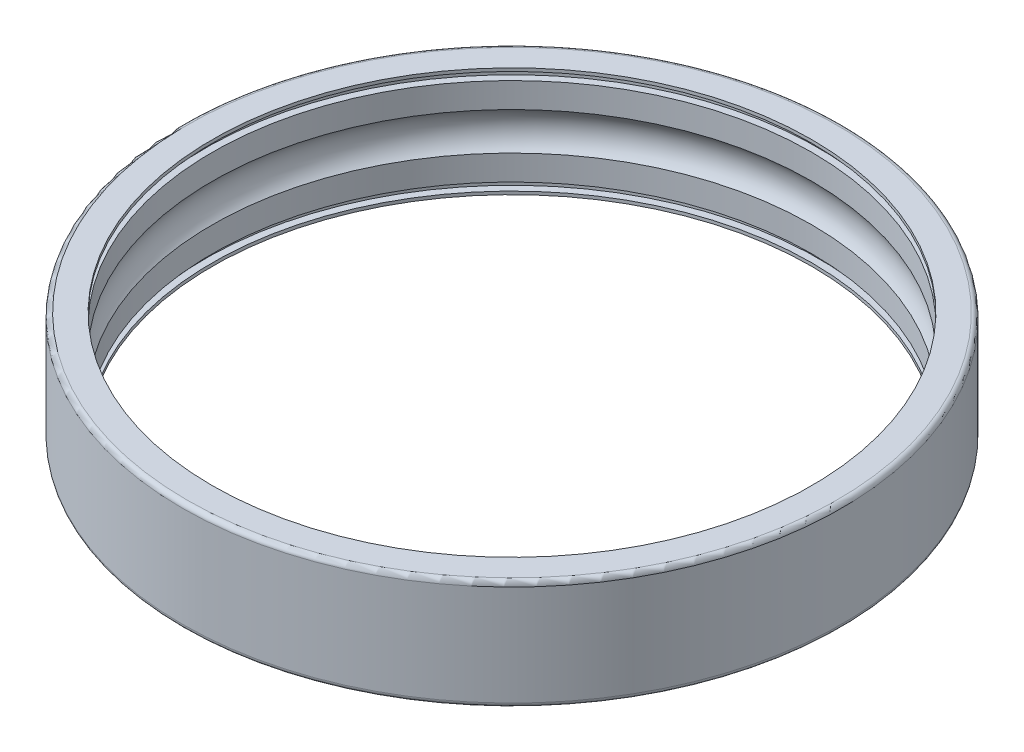
ISO-10303-21;
HEADER;
FILE_DESCRIPTION(('STEP AP214'),'2;1');
FILE_NAME('part.step','',(''),(''),'','','');
FILE_SCHEMA(('AUTOMOTIVE_DESIGN { 1 0 10303 214 1 1 1 1 }'));
ENDSEC;
DATA;
#1=APPLICATION_CONTEXT('core data for automotive mechanical design processes');
#2=APPLICATION_PROTOCOL_DEFINITION('international standard','automotive_design',2000,#1);
#3=PRODUCT_CONTEXT('',#1,'mechanical');
#4=PRODUCT('Part','Part','',(#3));
#5=PRODUCT_RELATED_PRODUCT_CATEGORY('part','',(#4));
#6=PRODUCT_DEFINITION_FORMATION('','',#4);
#7=PRODUCT_DEFINITION_CONTEXT('part definition',#1,'design');
#8=PRODUCT_DEFINITION('design','',#6,#7);
#9=PRODUCT_DEFINITION_SHAPE('','',#8);
#10=(LENGTH_UNIT() NAMED_UNIT(*) SI_UNIT(.MILLI.,.METRE.));
#11=(NAMED_UNIT(*) PLANE_ANGLE_UNIT() SI_UNIT($,.RADIAN.));
#12=(NAMED_UNIT(*) SI_UNIT($,.STERADIAN.) SOLID_ANGLE_UNIT());
#13=UNCERTAINTY_MEASURE_WITH_UNIT(LENGTH_MEASURE(1.E-05),#10,'distance_accuracy_value','');
#14=(GEOMETRIC_REPRESENTATION_CONTEXT(3) GLOBAL_UNCERTAINTY_ASSIGNED_CONTEXT((#13)) GLOBAL_UNIT_ASSIGNED_CONTEXT((#10,
#11,#12)) REPRESENTATION_CONTEXT('',''));
#15=CARTESIAN_POINT('',(0.,0.,0.));
#16=DIRECTION('',(0.,0.,1.));
#17=DIRECTION('',(1.,0.,0.));
#18=AXIS2_PLACEMENT_3D('',#15,#16,#17);
#19=CARTESIAN_POINT('',(0.,-3.85,0.));
#20=DIRECTION('',(0.,1.,0.));
#21=DIRECTION('',(0.,0.,-1.));
#22=AXIS2_PLACEMENT_3D('',#19,#20,#21);
#23=CYLINDRICAL_SURFACE('',#22,19.1);
#24=CARTESIAN_POINT('',(0.,-2.8,0.));
#25=DIRECTION('',(0.,1.,0.));
#26=DIRECTION('',(0.,0.,-1.));
#27=AXIS2_PLACEMENT_3D('',#24,#25,#26);
#28=CIRCLE('',#27,19.1);
#29=CARTESIAN_POINT('',(0.,-2.8,19.1));
#30=VERTEX_POINT('',#29);
#31=EDGE_CURVE('E11',#30,#30,#28,.T.);
#32=ORIENTED_EDGE('',*,*,#31,.F.);
#33=EDGE_LOOP('',(#32));
#34=FACE_BOUND('',#33,.T.);
#35=CARTESIAN_POINT('',(0.,-1.201350802222,0.));
#36=DIRECTION('',(0.,1.,0.));
#37=DIRECTION('',(0.,0.,-1.));
#38=AXIS2_PLACEMENT_3D('',#35,#36,#37);
#39=CIRCLE('',#38,19.1);
#40=CARTESIAN_POINT('',(0.,-1.201350802222,-19.1));
#41=VERTEX_POINT('',#40);
#42=EDGE_CURVE('E104',#41,#41,#39,.T.);
#43=ORIENTED_EDGE('',*,*,#42,.T.);
#44=EDGE_LOOP('',(#43));
#45=FACE_BOUND('',#44,.T.);
#46=ADVANCED_FACE('F17',(#34,#45),#23,.F.);
#47=CARTESIAN_POINT('',(0.,-2.8,0.));
#48=DIRECTION('',(0.,1.,0.));
#49=DIRECTION('',(1.,0.,0.));
#50=AXIS2_PLACEMENT_3D('',#47,#48,#49);
#51=PLANE('',#50);
#52=ORIENTED_EDGE('',*,*,#31,.T.);
#53=EDGE_LOOP('',(#52));
#54=FACE_BOUND('',#53,.T.);
#55=CARTESIAN_POINT('',(0.,-2.8,0.));
#56=DIRECTION('',(0.,-1.,0.));
#57=DIRECTION('',(0.,0.,-1.));
#58=AXIS2_PLACEMENT_3D('',#55,#56,#57);
#59=CIRCLE('',#58,19.55);
#60=CARTESIAN_POINT('',(0.,-2.8,19.55));
#61=VERTEX_POINT('',#60);
#62=EDGE_CURVE('E27',#61,#61,#59,.T.);
#63=ORIENTED_EDGE('',*,*,#62,.T.);
#64=EDGE_LOOP('',(#63));
#65=FACE_BOUND('',#64,.T.);
#66=ADVANCED_FACE('F169',(#54,#65),#51,.F.);
#67=CARTESIAN_POINT('',(0.,-3.85,0.));
#68=DIRECTION('',(0.,1.,0.));
#69=DIRECTION('',(0.,0.,-1.));
#70=AXIS2_PLACEMENT_3D('',#67,#68,#69);
#71=CYLINDRICAL_SURFACE('',#70,19.55);
#72=CARTESIAN_POINT('',(0.,-3.3,0.));
#73=DIRECTION('',(0.,1.,0.));
#74=DIRECTION('',(0.,0.,-1.));
#75=AXIS2_PLACEMENT_3D('',#72,#73,#74);
#76=CIRCLE('',#75,19.55);
#77=CARTESIAN_POINT('',(0.,-3.3,19.55));
#78=VERTEX_POINT('',#77);
#79=EDGE_CURVE('E129',#78,#78,#76,.T.);
#80=ORIENTED_EDGE('',*,*,#79,.F.);
#81=EDGE_LOOP('',(#80));
#82=FACE_BOUND('',#81,.T.);
#83=ORIENTED_EDGE('',*,*,#62,.F.);
#84=EDGE_LOOP('',(#83));
#85=FACE_BOUND('',#84,.T.);
#86=ADVANCED_FACE('F174',(#82,#85),#71,.F.);
#87=CARTESIAN_POINT('',(0.,-3.3,0.));
#88=DIRECTION('',(0.,1.,0.));
#89=DIRECTION('',(1.,0.,0.));
#90=AXIS2_PLACEMENT_3D('',#87,#88,#89);
#91=PLANE('',#90);
#92=CARTESIAN_POINT('',(0.,-3.3,0.));
#93=DIRECTION('',(0.,-1.,0.));
#94=DIRECTION('',(0.,0.,-1.));
#95=AXIS2_PLACEMENT_3D('',#92,#93,#94);
#96=CIRCLE('',#95,19.1);
#97=CARTESIAN_POINT('',(0.,-3.3,19.1));
#98=VERTEX_POINT('',#97);
#99=EDGE_CURVE('E77',#98,#98,#96,.T.);
#100=ORIENTED_EDGE('',*,*,#99,.T.);
#101=EDGE_LOOP('',(#100));
#102=FACE_BOUND('',#101,.T.);
#103=ORIENTED_EDGE('',*,*,#79,.T.);
#104=EDGE_LOOP('',(#103));
#105=FACE_BOUND('',#104,.T.);
#106=ADVANCED_FACE('F178',(#102,#105),#91,.T.);
#107=CARTESIAN_POINT('',(0.,-3.85,0.));
#108=DIRECTION('',(0.,1.,0.));
#109=DIRECTION('',(0.,0.,-1.));
#110=AXIS2_PLACEMENT_3D('',#107,#108,#109);
#111=CYLINDRICAL_SURFACE('',#110,19.1);
#112=CARTESIAN_POINT('',(0.,-3.5,0.));
#113=DIRECTION('',(0.,1.,0.));
#114=DIRECTION('',(0.,0.,-1.));
#115=AXIS2_PLACEMENT_3D('',#112,#113,#114);
#116=CIRCLE('',#115,19.1);
#117=CARTESIAN_POINT('',(0.,-3.5,19.1));
#118=VERTEX_POINT('',#117);
#119=EDGE_CURVE('E89',#118,#118,#116,.T.);
#120=ORIENTED_EDGE('',*,*,#119,.F.);
#121=EDGE_LOOP('',(#120));
#122=FACE_BOUND('',#121,.T.);
#123=ORIENTED_EDGE('',*,*,#99,.F.);
#124=EDGE_LOOP('',(#123));
#125=FACE_BOUND('',#124,.T.);
#126=ADVANCED_FACE('F185',(#122,#125),#111,.F.);
#127=CARTESIAN_POINT('',(0.,-3.5,0.));
#128=DIRECTION('',(0.,1.,0.));
#129=DIRECTION('',(1.,0.,0.));
#130=AXIS2_PLACEMENT_3D('',#127,#128,#129);
#131=PLANE('',#130);
#132=ORIENTED_EDGE('',*,*,#119,.T.);
#133=EDGE_LOOP('',(#132));
#134=FACE_BOUND('',#133,.T.);
#135=CARTESIAN_POINT('',(0.,-3.5,0.));
#136=DIRECTION('',(0.,-1.,0.));
#137=DIRECTION('',(0.,0.,-1.));
#138=AXIS2_PLACEMENT_3D('',#135,#136,#137);
#139=CIRCLE('',#138,20.7);
#140=CARTESIAN_POINT('',(0.,-3.5,20.7));
#141=VERTEX_POINT('',#140);
#142=EDGE_CURVE('E123',#141,#141,#139,.T.);
#143=ORIENTED_EDGE('',*,*,#142,.T.);
#144=EDGE_LOOP('',(#143));
#145=FACE_BOUND('',#144,.T.);
#146=ADVANCED_FACE('F193',(#134,#145),#131,.F.);
#147=CARTESIAN_POINT('',(0.,-3.2,0.));
#148=DIRECTION('',(0.,1.,0.));
#149=DIRECTION('',(0.,0.,-1.));
#150=AXIS2_PLACEMENT_3D('',#147,#148,#149);
#151=TOROIDAL_SURFACE('',#150,20.7,0.3);
#152=CARTESIAN_POINT('',(0.,-3.2,0.));
#153=DIRECTION('',(0.,-1.,0.));
#154=DIRECTION('',(0.,0.,-1.));
#155=AXIS2_PLACEMENT_3D('',#152,#153,#154);
#156=CIRCLE('',#155,21.);
#157=CARTESIAN_POINT('',(0.,-3.2,-21.));
#158=VERTEX_POINT('',#157);
#159=EDGE_CURVE('E126',#158,#158,#156,.T.);
#160=ORIENTED_EDGE('',*,*,#159,.T.);
#161=EDGE_LOOP('',(#160));
#162=FACE_BOUND('',#161,.T.);
#163=ORIENTED_EDGE('',*,*,#142,.F.);
#164=EDGE_LOOP('',(#163));
#165=FACE_BOUND('',#164,.T.);
#166=ADVANCED_FACE('F205',(#162,#165),#151,.T.);
#167=CARTESIAN_POINT('',(0.,-3.85,0.));
#168=DIRECTION('',(0.,1.,0.));
#169=DIRECTION('',(0.,0.,-1.));
#170=AXIS2_PLACEMENT_3D('',#167,#168,#169);
#171=CYLINDRICAL_SURFACE('',#170,21.);
#172=ORIENTED_EDGE('',*,*,#159,.F.);
#173=EDGE_LOOP('',(#172));
#174=FACE_BOUND('',#173,.T.);
#175=CARTESIAN_POINT('',(0.,3.2,0.));
#176=DIRECTION('',(0.,-1.,0.));
#177=DIRECTION('',(0.,0.,-1.));
#178=AXIS2_PLACEMENT_3D('',#175,#176,#177);
#179=CIRCLE('',#178,21.);
#180=CARTESIAN_POINT('',(0.,3.2,21.));
#181=VERTEX_POINT('',#180);
#182=EDGE_CURVE('E130',#181,#181,#179,.T.);
#183=ORIENTED_EDGE('',*,*,#182,.T.);
#184=EDGE_LOOP('',(#183));
#185=FACE_BOUND('',#184,.T.);
#186=ADVANCED_FACE('F203',(#174,#185),#171,.T.);
#187=CARTESIAN_POINT('',(0.,3.2,0.));
#188=DIRECTION('',(0.,1.,0.));
#189=DIRECTION('',(0.,0.,-1.));
#190=AXIS2_PLACEMENT_3D('',#187,#188,#189);
#191=TOROIDAL_SURFACE('',#190,20.7,0.3);
#192=CARTESIAN_POINT('',(0.,3.5,0.));
#193=DIRECTION('',(0.,1.,0.));
#194=DIRECTION('',(0.,0.,-1.));
#195=AXIS2_PLACEMENT_3D('',#192,#193,#194);
#196=CIRCLE('',#195,20.7);
#197=CARTESIAN_POINT('',(0.,3.5,20.7));
#198=VERTEX_POINT('',#197);
#199=EDGE_CURVE('E133',#198,#198,#196,.T.);
#200=ORIENTED_EDGE('',*,*,#199,.F.);
#201=EDGE_LOOP('',(#200));
#202=FACE_BOUND('',#201,.T.);
#203=ORIENTED_EDGE('',*,*,#182,.F.);
#204=EDGE_LOOP('',(#203));
#205=FACE_BOUND('',#204,.T.);
#206=ADVANCED_FACE('F164',(#202,#205),#191,.T.);
#207=CARTESIAN_POINT('',(0.,3.5,0.));
#208=DIRECTION('',(0.,1.,0.));
#209=DIRECTION('',(1.,0.,0.));
#210=AXIS2_PLACEMENT_3D('',#207,#208,#209);
#211=PLANE('',#210);
#212=CARTESIAN_POINT('',(0.,3.5,0.));
#213=DIRECTION('',(0.,-1.,0.));
#214=DIRECTION('',(0.,0.,-1.));
#215=AXIS2_PLACEMENT_3D('',#212,#213,#214);
#216=CIRCLE('',#215,19.1);
#217=CARTESIAN_POINT('',(0.,3.5,19.1));
#218=VERTEX_POINT('',#217);
#219=EDGE_CURVE('E122',#218,#218,#216,.T.);
#220=ORIENTED_EDGE('',*,*,#219,.T.);
#221=EDGE_LOOP('',(#220));
#222=FACE_BOUND('',#221,.T.);
#223=ORIENTED_EDGE('',*,*,#199,.T.);
#224=EDGE_LOOP('',(#223));
#225=FACE_BOUND('',#224,.T.);
#226=ADVANCED_FACE('F148',(#222,#225),#211,.T.);
#227=CARTESIAN_POINT('',(0.,-3.85,0.));
#228=DIRECTION('',(0.,1.,0.));
#229=DIRECTION('',(0.,0.,-1.));
#230=AXIS2_PLACEMENT_3D('',#227,#228,#229);
#231=CYLINDRICAL_SURFACE('',#230,19.1);
#232=CARTESIAN_POINT('',(0.,3.3,0.));
#233=DIRECTION('',(0.,1.,0.));
#234=DIRECTION('',(0.,0.,-1.));
#235=AXIS2_PLACEMENT_3D('',#232,#233,#234);
#236=CIRCLE('',#235,19.1);
#237=CARTESIAN_POINT('',(0.,3.3,19.1));
#238=VERTEX_POINT('',#237);
#239=EDGE_CURVE('E119',#238,#238,#236,.T.);
#240=ORIENTED_EDGE('',*,*,#239,.F.);
#241=EDGE_LOOP('',(#240));
#242=FACE_BOUND('',#241,.T.);
#243=ORIENTED_EDGE('',*,*,#219,.F.);
#244=EDGE_LOOP('',(#243));
#245=FACE_BOUND('',#244,.T.);
#246=ADVANCED_FACE('F151',(#242,#245),#231,.F.);
#247=CARTESIAN_POINT('',(0.,3.3,0.));
#248=DIRECTION('',(0.,1.,0.));
#249=DIRECTION('',(1.,0.,0.));
#250=AXIS2_PLACEMENT_3D('',#247,#248,#249);
#251=PLANE('',#250);
#252=ORIENTED_EDGE('',*,*,#239,.T.);
#253=EDGE_LOOP('',(#252));
#254=FACE_BOUND('',#253,.T.);
#255=CARTESIAN_POINT('',(0.,3.3,0.));
#256=DIRECTION('',(0.,-1.,0.));
#257=DIRECTION('',(0.,0.,-1.));
#258=AXIS2_PLACEMENT_3D('',#255,#256,#257);
#259=CIRCLE('',#258,19.55);
#260=CARTESIAN_POINT('',(0.,3.3,19.55));
#261=VERTEX_POINT('',#260);
#262=EDGE_CURVE('E118',#261,#261,#259,.T.);
#263=ORIENTED_EDGE('',*,*,#262,.T.);
#264=EDGE_LOOP('',(#263));
#265=FACE_BOUND('',#264,.T.);
#266=ADVANCED_FACE('F153',(#254,#265),#251,.F.);
#267=CARTESIAN_POINT('',(0.,-3.85,0.));
#268=DIRECTION('',(0.,1.,0.));
#269=DIRECTION('',(0.,0.,-1.));
#270=AXIS2_PLACEMENT_3D('',#267,#268,#269);
#271=CYLINDRICAL_SURFACE('',#270,19.55);
#272=CARTESIAN_POINT('',(0.,2.8,0.));
#273=DIRECTION('',(0.,1.,0.));
#274=DIRECTION('',(0.,0.,-1.));
#275=AXIS2_PLACEMENT_3D('',#272,#273,#274);
#276=CIRCLE('',#275,19.55);
#277=CARTESIAN_POINT('',(0.,2.8,19.55));
#278=VERTEX_POINT('',#277);
#279=EDGE_CURVE('E111',#278,#278,#276,.T.);
#280=ORIENTED_EDGE('',*,*,#279,.F.);
#281=EDGE_LOOP('',(#280));
#282=FACE_BOUND('',#281,.T.);
#283=ORIENTED_EDGE('',*,*,#262,.F.);
#284=EDGE_LOOP('',(#283));
#285=FACE_BOUND('',#284,.T.);
#286=ADVANCED_FACE('F161',(#282,#285),#271,.F.);
#287=CARTESIAN_POINT('',(0.,2.8,0.));
#288=DIRECTION('',(0.,1.,0.));
#289=DIRECTION('',(1.,0.,0.));
#290=AXIS2_PLACEMENT_3D('',#287,#288,#289);
#291=PLANE('',#290);
#292=CARTESIAN_POINT('',(0.,2.8,0.));
#293=DIRECTION('',(0.,-1.,0.));
#294=DIRECTION('',(0.,0.,-1.));
#295=AXIS2_PLACEMENT_3D('',#292,#293,#294);
#296=CIRCLE('',#295,19.1);
#297=CARTESIAN_POINT('',(0.,2.8,-19.1));
#298=VERTEX_POINT('',#297);
#299=EDGE_CURVE('E20',#298,#298,#296,.T.);
#300=ORIENTED_EDGE('',*,*,#299,.T.);
#301=EDGE_LOOP('',(#300));
#302=FACE_BOUND('',#301,.T.);
#303=ORIENTED_EDGE('',*,*,#279,.T.);
#304=EDGE_LOOP('',(#303));
#305=FACE_BOUND('',#304,.T.);
#306=ADVANCED_FACE('F186',(#302,#305),#291,.T.);
#307=CARTESIAN_POINT('',(0.,-3.85,0.));
#308=DIRECTION('',(0.,1.,0.));
#309=DIRECTION('',(0.,0.,-1.));
#310=AXIS2_PLACEMENT_3D('',#307,#308,#309);
#311=CYLINDRICAL_SURFACE('',#310,19.1);
#312=ORIENTED_EDGE('',*,*,#299,.F.);
#313=EDGE_LOOP('',(#312));
#314=FACE_BOUND('',#313,.T.);
#315=CARTESIAN_POINT('',(0.,1.201350802222,0.));
#316=DIRECTION('',(0.,-1.,0.));
#317=DIRECTION('',(0.,0.,-1.));
#318=AXIS2_PLACEMENT_3D('',#315,#316,#317);
#319=CIRCLE('',#318,19.1);
#320=CARTESIAN_POINT('',(0.,1.201350802222,19.1));
#321=VERTEX_POINT('',#320);
#322=EDGE_CURVE('E99',#321,#321,#319,.T.);
#323=ORIENTED_EDGE('',*,*,#322,.T.);
#324=EDGE_LOOP('',(#323));
#325=FACE_BOUND('',#324,.T.);
#326=ADVANCED_FACE('F188',(#314,#325),#311,.F.);
#327=CARTESIAN_POINT('',(0.,0.,0.));
#328=DIRECTION('',(0.,1.,0.));
#329=DIRECTION('',(0.,0.,-1.));
#330=AXIS2_PLACEMENT_3D('',#327,#328,#329);
#331=TOROIDAL_SURFACE('',#330,17.8275,1.75);
#332=ORIENTED_EDGE('',*,*,#42,.F.);
#333=EDGE_LOOP('',(#332));
#334=FACE_BOUND('',#333,.T.);
#335=ORIENTED_EDGE('',*,*,#322,.F.);
#336=EDGE_LOOP('',(#335));
#337=FACE_BOUND('',#336,.T.);
#338=ADVANCED_FACE('F197',(#334,#337),#331,.F.);
#339=CLOSED_SHELL('',(#46,#66,#86,#106,#126,#146,#166,#186,#206,#226,#246,#266,#286,#306,#326,#338));
#340=MANIFOLD_SOLID_BREP('B1',#339);
#341=ADVANCED_BREP_SHAPE_REPRESENTATION('',(#18,#340),#14);
#342=SHAPE_DEFINITION_REPRESENTATION(#9,#341);
ENDSEC;
END-ISO-10303-21;
